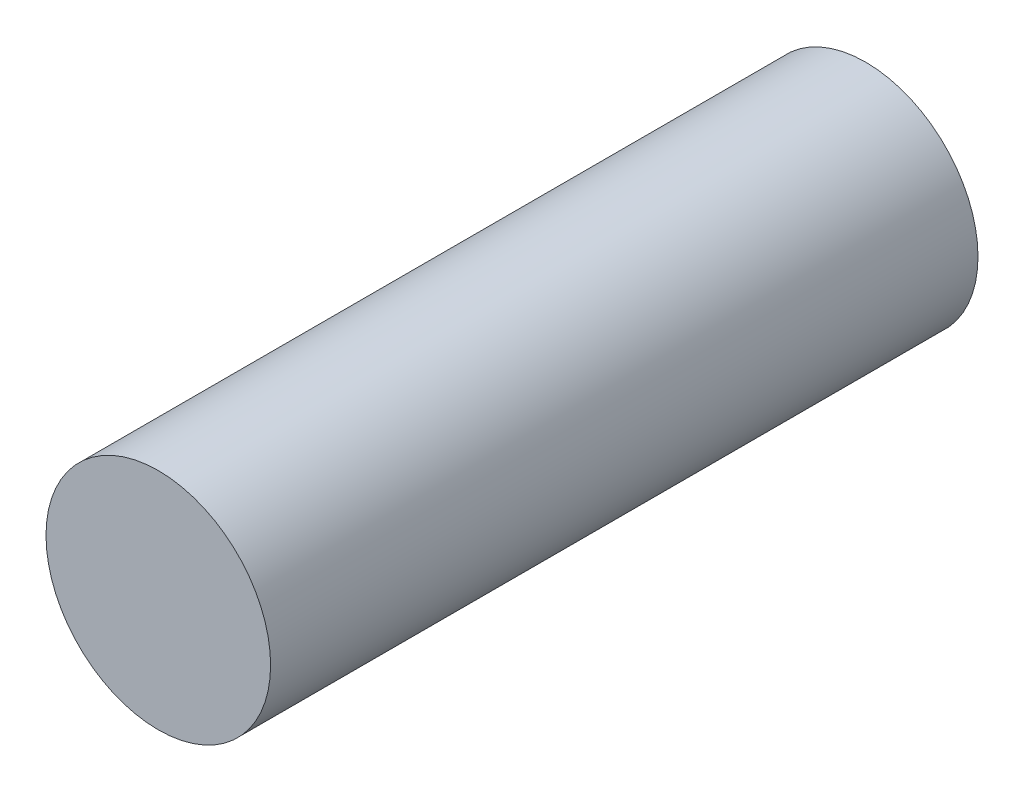
ISO-10303-21;
HEADER;
FILE_DESCRIPTION(('STEP AP214'),'2;1');
FILE_NAME('part.step','',(''),(''),'','','');
FILE_SCHEMA(('AUTOMOTIVE_DESIGN { 1 0 10303 214 1 1 1 1 }'));
ENDSEC;
DATA;
#1=APPLICATION_CONTEXT('core data for automotive mechanical design processes');
#2=APPLICATION_PROTOCOL_DEFINITION('international standard','automotive_design',2000,#1);
#3=PRODUCT_CONTEXT('',#1,'mechanical');
#4=PRODUCT('Part','Part','',(#3));
#5=PRODUCT_RELATED_PRODUCT_CATEGORY('part','',(#4));
#6=PRODUCT_DEFINITION_FORMATION('','',#4);
#7=PRODUCT_DEFINITION_CONTEXT('part definition',#1,'design');
#8=PRODUCT_DEFINITION('design','',#6,#7);
#9=PRODUCT_DEFINITION_SHAPE('','',#8);
#10=(LENGTH_UNIT() NAMED_UNIT(*) SI_UNIT(.MILLI.,.METRE.));
#11=(NAMED_UNIT(*) PLANE_ANGLE_UNIT() SI_UNIT($,.RADIAN.));
#12=(NAMED_UNIT(*) SI_UNIT($,.STERADIAN.) SOLID_ANGLE_UNIT());
#13=UNCERTAINTY_MEASURE_WITH_UNIT(LENGTH_MEASURE(1.E-05),#10,'distance_accuracy_value','');
#14=(GEOMETRIC_REPRESENTATION_CONTEXT(3) GLOBAL_UNCERTAINTY_ASSIGNED_CONTEXT((#13)) GLOBAL_UNIT_ASSIGNED_CONTEXT((#10,
#11,#12)) REPRESENTATION_CONTEXT('',''));
#15=CARTESIAN_POINT('',(0.,0.,0.));
#16=DIRECTION('',(0.,0.,1.));
#17=DIRECTION('',(1.,0.,0.));
#18=AXIS2_PLACEMENT_3D('',#15,#16,#17);
#19=CARTESIAN_POINT('',(0.,0.,20.));
#20=DIRECTION('',(0.,0.,-1.));
#21=DIRECTION('',(-1.,0.,0.));
#22=AXIS2_PLACEMENT_3D('',#19,#20,#21);
#23=CYLINDRICAL_SURFACE('',#22,6.35);
#24=CARTESIAN_POINT('',(0.,0.,20.));
#25=DIRECTION('',(0.,0.,1.));
#26=DIRECTION('',(1.,0.,0.));
#27=AXIS2_PLACEMENT_3D('',#24,#25,#26);
#28=CIRCLE('',#27,6.35);
#29=CARTESIAN_POINT('',(6.35,0.,20.));
#30=VERTEX_POINT('',#29);
#31=EDGE_CURVE('E10',#30,#30,#28,.T.);
#32=ORIENTED_EDGE('',*,*,#31,.F.);
#33=EDGE_LOOP('',(#32));
#34=FACE_BOUND('',#33,.T.);
#35=CARTESIAN_POINT('',(0.,0.,-20.));
#36=DIRECTION('',(0.,0.,1.));
#37=DIRECTION('',(1.,0.,0.));
#38=AXIS2_PLACEMENT_3D('',#35,#36,#37);
#39=CIRCLE('',#38,6.35);
#40=CARTESIAN_POINT('',(6.35,0.,-20.));
#41=VERTEX_POINT('',#40);
#42=EDGE_CURVE('E42',#41,#41,#39,.T.);
#43=ORIENTED_EDGE('',*,*,#42,.T.);
#44=EDGE_LOOP('',(#43));
#45=FACE_BOUND('',#44,.T.);
#46=ADVANCED_FACE('F39',(#34,#45),#23,.T.);
#47=CARTESIAN_POINT('',(0.,0.,20.));
#48=DIRECTION('',(0.,0.,1.));
#49=DIRECTION('',(1.,0.,0.));
#50=AXIS2_PLACEMENT_3D('',#47,#48,#49);
#51=PLANE('',#50);
#52=ORIENTED_EDGE('',*,*,#31,.T.);
#53=EDGE_LOOP('',(#52));
#54=FACE_BOUND('',#53,.T.);
#55=ADVANCED_FACE('F56',(#54),#51,.T.);
#56=CARTESIAN_POINT('',(0.,0.,-20.));
#57=DIRECTION('',(0.,0.,1.));
#58=DIRECTION('',(1.,0.,0.));
#59=AXIS2_PLACEMENT_3D('',#56,#57,#58);
#60=PLANE('',#59);
#61=ORIENTED_EDGE('',*,*,#42,.F.);
#62=EDGE_LOOP('',(#61));
#63=FACE_BOUND('',#62,.T.);
#64=ADVANCED_FACE('F54',(#63),#60,.F.);
#65=CLOSED_SHELL('',(#46,#55,#64));
#66=MANIFOLD_SOLID_BREP('B2',#65);
#67=ADVANCED_BREP_SHAPE_REPRESENTATION('',(#18,#66),#14);
#68=SHAPE_DEFINITION_REPRESENTATION(#9,#67);
ENDSEC;
END-ISO-10303-21;
